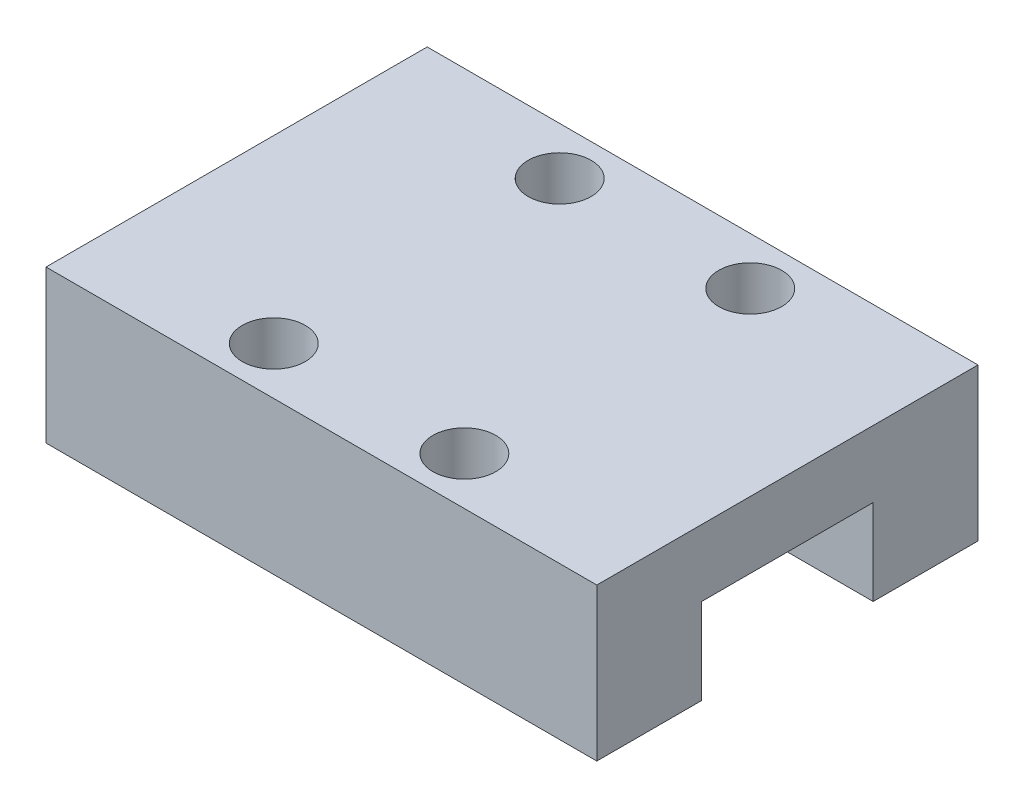
ISO-10303-21;
HEADER;
FILE_DESCRIPTION(('STEP AP214'),'2;1');
FILE_NAME('part.step','',(''),(''),'','','');
FILE_SCHEMA(('AUTOMOTIVE_DESIGN { 1 0 10303 214 1 1 1 1 }'));
ENDSEC;
DATA;
#1=APPLICATION_CONTEXT('core data for automotive mechanical design processes');
#2=APPLICATION_PROTOCOL_DEFINITION('international standard','automotive_design',2000,#1);
#3=PRODUCT_CONTEXT('',#1,'mechanical');
#4=PRODUCT('Part','Part','',(#3));
#5=PRODUCT_RELATED_PRODUCT_CATEGORY('part','',(#4));
#6=PRODUCT_DEFINITION_FORMATION('','',#4);
#7=PRODUCT_DEFINITION_CONTEXT('part definition',#1,'design');
#8=PRODUCT_DEFINITION('design','',#6,#7);
#9=PRODUCT_DEFINITION_SHAPE('','',#8);
#10=(LENGTH_UNIT() NAMED_UNIT(*) SI_UNIT(.MILLI.,.METRE.));
#11=(NAMED_UNIT(*) PLANE_ANGLE_UNIT() SI_UNIT($,.RADIAN.));
#12=(NAMED_UNIT(*) SI_UNIT($,.STERADIAN.) SOLID_ANGLE_UNIT());
#13=UNCERTAINTY_MEASURE_WITH_UNIT(LENGTH_MEASURE(1.E-05),#10,'distance_accuracy_value','');
#14=(GEOMETRIC_REPRESENTATION_CONTEXT(3) GLOBAL_UNCERTAINTY_ASSIGNED_CONTEXT((#13)) GLOBAL_UNIT_ASSIGNED_CONTEXT((#10,
#11,#12)) REPRESENTATION_CONTEXT('',''));
#15=CARTESIAN_POINT('',(0.,0.,0.));
#16=DIRECTION('',(0.,0.,1.));
#17=DIRECTION('',(1.,0.,0.));
#18=AXIS2_PLACEMENT_3D('',#15,#16,#17);
#19=CARTESIAN_POINT('',(14.45,-7.99999999999999,10.));
#20=DIRECTION('',(0.,0.,-1.));
#21=DIRECTION('',(-1.,0.,0.));
#22=AXIS2_PLACEMENT_3D('',#19,#20,#21);
#23=PLANE('',#22);
#24=DIRECTION('',(0.,-1.,0.));
#25=VECTOR('',#24,1.);
#26=CARTESIAN_POINT('',(-14.45,-7.99999999999999,10.));
#27=LINE('',#26,#25);
#28=CARTESIAN_POINT('',(-14.45,0.,10.));
#29=VERTEX_POINT('',#28);
#30=CARTESIAN_POINT('',(-14.45,-7.99999999999999,10.));
#31=VERTEX_POINT('',#30);
#32=EDGE_CURVE('E132',#29,#31,#27,.T.);
#33=ORIENTED_EDGE('',*,*,#32,.T.);
#34=DIRECTION('',(-1.,0.,0.));
#35=VECTOR('',#34,1.);
#36=CARTESIAN_POINT('',(14.45,-7.99999999999999,10.));
#37=LINE('',#36,#35);
#38=CARTESIAN_POINT('',(14.45,-7.99999999999999,10.));
#39=VERTEX_POINT('',#38);
#40=EDGE_CURVE('E40',#39,#31,#37,.T.);
#41=ORIENTED_EDGE('',*,*,#40,.F.);
#42=DIRECTION('',(0.,-1.,0.));
#43=VECTOR('',#42,1.);
#44=CARTESIAN_POINT('',(14.45,-7.99999999999999,10.));
#45=LINE('',#44,#43);
#46=CARTESIAN_POINT('',(14.45,0.,10.));
#47=VERTEX_POINT('',#46);
#48=EDGE_CURVE('E92',#47,#39,#45,.T.);
#49=ORIENTED_EDGE('',*,*,#48,.F.);
#50=DIRECTION('',(-1.,0.,0.));
#51=VECTOR('',#50,1.);
#52=CARTESIAN_POINT('',(14.45,0.,10.));
#53=LINE('',#52,#51);
#54=EDGE_CURVE('E11',#47,#29,#53,.T.);
#55=ORIENTED_EDGE('',*,*,#54,.T.);
#56=EDGE_LOOP('',(#33,#41,#49,#55));
#57=FACE_BOUND('',#56,.T.);
#58=ADVANCED_FACE('F32',(#57),#23,.F.);
#59=CARTESIAN_POINT('',(14.45,-7.99999999999999,4.5));
#60=DIRECTION('',(0.,1.,0.));
#61=DIRECTION('',(0.,0.,1.));
#62=AXIS2_PLACEMENT_3D('',#59,#60,#61);
#63=PLANE('',#62);
#64=DIRECTION('',(0.,0.,-1.));
#65=VECTOR('',#64,1.);
#66=CARTESIAN_POINT('',(-14.45,-7.99999999999999,4.5));
#67=LINE('',#66,#65);
#68=CARTESIAN_POINT('',(-14.45,-7.99999999999999,4.5));
#69=VERTEX_POINT('',#68);
#70=EDGE_CURVE('E134',#31,#69,#67,.T.);
#71=ORIENTED_EDGE('',*,*,#70,.T.);
#72=DIRECTION('',(-1.,0.,0.));
#73=VECTOR('',#72,1.);
#74=CARTESIAN_POINT('',(14.45,-7.99999999999999,4.5));
#75=LINE('',#74,#73);
#76=CARTESIAN_POINT('',(14.45,-7.99999999999999,4.5));
#77=VERTEX_POINT('',#76);
#78=EDGE_CURVE('E152',#77,#69,#75,.T.);
#79=ORIENTED_EDGE('',*,*,#78,.F.);
#80=DIRECTION('',(0.,0.,-1.));
#81=VECTOR('',#80,1.);
#82=CARTESIAN_POINT('',(14.45,-7.99999999999999,4.5));
#83=LINE('',#82,#81);
#84=EDGE_CURVE('E160',#39,#77,#83,.T.);
#85=ORIENTED_EDGE('',*,*,#84,.F.);
#86=ORIENTED_EDGE('',*,*,#40,.T.);
#87=EDGE_LOOP('',(#71,#79,#85,#86));
#88=FACE_BOUND('',#87,.T.);
#89=ADVANCED_FACE('F158',(#88),#63,.F.);
#90=CARTESIAN_POINT('',(14.45,-3.49999999999999,4.5));
#91=DIRECTION('',(0.,0.,1.));
#92=DIRECTION('',(1.,0.,0.));
#93=AXIS2_PLACEMENT_3D('',#90,#91,#92);
#94=PLANE('',#93);
#95=DIRECTION('',(0.,1.,0.));
#96=VECTOR('',#95,1.);
#97=CARTESIAN_POINT('',(-14.45,-3.49999999999999,4.5));
#98=LINE('',#97,#96);
#99=CARTESIAN_POINT('',(-14.45,-3.49999999999999,4.5));
#100=VERTEX_POINT('',#99);
#101=EDGE_CURVE('E137',#69,#100,#98,.T.);
#102=ORIENTED_EDGE('',*,*,#101,.T.);
#103=DIRECTION('',(-1.,0.,0.));
#104=VECTOR('',#103,1.);
#105=CARTESIAN_POINT('',(14.45,-3.49999999999999,4.5));
#106=LINE('',#105,#104);
#107=CARTESIAN_POINT('',(14.45,-3.49999999999999,4.5));
#108=VERTEX_POINT('',#107);
#109=EDGE_CURVE('E149',#108,#100,#106,.T.);
#110=ORIENTED_EDGE('',*,*,#109,.F.);
#111=DIRECTION('',(0.,1.,0.));
#112=VECTOR('',#111,1.);
#113=CARTESIAN_POINT('',(14.45,-3.49999999999999,4.5));
#114=LINE('',#113,#112);
#115=EDGE_CURVE('E173',#77,#108,#114,.T.);
#116=ORIENTED_EDGE('',*,*,#115,.F.);
#117=ORIENTED_EDGE('',*,*,#78,.T.);
#118=EDGE_LOOP('',(#102,#110,#116,#117));
#119=FACE_BOUND('',#118,.T.);
#120=ADVANCED_FACE('F169',(#119),#94,.F.);
#121=CARTESIAN_POINT('',(14.45,-3.49999999999999,-4.5));
#122=DIRECTION('',(0.,1.,0.));
#123=DIRECTION('',(0.,0.,1.));
#124=AXIS2_PLACEMENT_3D('',#121,#122,#123);
#125=PLANE('',#124);
#126=DIRECTION('',(0.,0.,-1.));
#127=VECTOR('',#126,1.);
#128=CARTESIAN_POINT('',(-14.45,-3.49999999999999,-4.5));
#129=LINE('',#128,#127);
#130=CARTESIAN_POINT('',(-14.45,-3.49999999999999,-4.5));
#131=VERTEX_POINT('',#130);
#132=EDGE_CURVE('E139',#100,#131,#129,.T.);
#133=ORIENTED_EDGE('',*,*,#132,.T.);
#134=DIRECTION('',(-1.,0.,0.));
#135=VECTOR('',#134,1.);
#136=CARTESIAN_POINT('',(14.45,-3.49999999999999,-4.5));
#137=LINE('',#136,#135);
#138=CARTESIAN_POINT('',(14.45,-3.49999999999999,-4.5));
#139=VERTEX_POINT('',#138);
#140=EDGE_CURVE('E121',#139,#131,#137,.T.);
#141=ORIENTED_EDGE('',*,*,#140,.F.);
#142=DIRECTION('',(0.,0.,-1.));
#143=VECTOR('',#142,1.);
#144=CARTESIAN_POINT('',(14.45,-3.49999999999999,-4.5));
#145=LINE('',#144,#143);
#146=EDGE_CURVE('E112',#108,#139,#145,.T.);
#147=ORIENTED_EDGE('',*,*,#146,.F.);
#148=ORIENTED_EDGE('',*,*,#109,.T.);
#149=EDGE_LOOP('',(#133,#141,#147,#148));
#150=FACE_BOUND('',#149,.T.);
#151=ADVANCED_FACE('F172',(#150),#125,.F.);
#152=CARTESIAN_POINT('',(14.45,-7.99999999999999,-4.5));
#153=DIRECTION('',(0.,0.,-1.));
#154=DIRECTION('',(-1.,0.,0.));
#155=AXIS2_PLACEMENT_3D('',#152,#153,#154);
#156=PLANE('',#155);
#157=DIRECTION('',(0.,-1.,0.));
#158=VECTOR('',#157,1.);
#159=CARTESIAN_POINT('',(-14.45,-7.99999999999999,-4.5));
#160=LINE('',#159,#158);
#161=CARTESIAN_POINT('',(-14.45,-7.99999999999999,-4.5));
#162=VERTEX_POINT('',#161);
#163=EDGE_CURVE('E120',#131,#162,#160,.T.);
#164=ORIENTED_EDGE('',*,*,#163,.T.);
#165=DIRECTION('',(-1.,0.,0.));
#166=VECTOR('',#165,1.);
#167=CARTESIAN_POINT('',(14.45,-7.99999999999999,-4.5));
#168=LINE('',#167,#166);
#169=CARTESIAN_POINT('',(14.45,-7.99999999999999,-4.5));
#170=VERTEX_POINT('',#169);
#171=EDGE_CURVE('E117',#170,#162,#168,.T.);
#172=ORIENTED_EDGE('',*,*,#171,.F.);
#173=DIRECTION('',(0.,-1.,0.));
#174=VECTOR('',#173,1.);
#175=CARTESIAN_POINT('',(14.45,-7.99999999999999,-4.5));
#176=LINE('',#175,#174);
#177=EDGE_CURVE('E106',#139,#170,#176,.T.);
#178=ORIENTED_EDGE('',*,*,#177,.F.);
#179=ORIENTED_EDGE('',*,*,#140,.T.);
#180=EDGE_LOOP('',(#164,#172,#178,#179));
#181=FACE_BOUND('',#180,.T.);
#182=ADVANCED_FACE('F118',(#181),#156,.F.);
#183=CARTESIAN_POINT('',(14.45,-7.99999999999999,-10.));
#184=DIRECTION('',(0.,1.,0.));
#185=DIRECTION('',(0.,0.,1.));
#186=AXIS2_PLACEMENT_3D('',#183,#184,#185);
#187=PLANE('',#186);
#188=DIRECTION('',(0.,0.,-1.));
#189=VECTOR('',#188,1.);
#190=CARTESIAN_POINT('',(-14.45,-7.99999999999999,-10.));
#191=LINE('',#190,#189);
#192=CARTESIAN_POINT('',(-14.45,-7.99999999999999,-10.));
#193=VERTEX_POINT('',#192);
#194=EDGE_CURVE('E78',#162,#193,#191,.T.);
#195=ORIENTED_EDGE('',*,*,#194,.T.);
#196=DIRECTION('',(-1.,0.,0.));
#197=VECTOR('',#196,1.);
#198=CARTESIAN_POINT('',(14.45,-7.99999999999999,-10.));
#199=LINE('',#198,#197);
#200=CARTESIAN_POINT('',(14.45,-7.99999999999999,-10.));
#201=VERTEX_POINT('',#200);
#202=EDGE_CURVE('E122',#201,#193,#199,.T.);
#203=ORIENTED_EDGE('',*,*,#202,.F.);
#204=DIRECTION('',(0.,0.,-1.));
#205=VECTOR('',#204,1.);
#206=CARTESIAN_POINT('',(14.45,-7.99999999999999,-10.));
#207=LINE('',#206,#205);
#208=EDGE_CURVE('E110',#170,#201,#207,.T.);
#209=ORIENTED_EDGE('',*,*,#208,.F.);
#210=ORIENTED_EDGE('',*,*,#171,.T.);
#211=EDGE_LOOP('',(#195,#203,#209,#210));
#212=FACE_BOUND('',#211,.T.);
#213=ADVANCED_FACE('F124',(#212),#187,.F.);
#214=CARTESIAN_POINT('',(14.45,0.,-10.));
#215=DIRECTION('',(0.,0.,1.));
#216=DIRECTION('',(1.,0.,0.));
#217=AXIS2_PLACEMENT_3D('',#214,#215,#216);
#218=PLANE('',#217);
#219=DIRECTION('',(0.,1.,0.));
#220=VECTOR('',#219,1.);
#221=CARTESIAN_POINT('',(-14.45,0.,-10.));
#222=LINE('',#221,#220);
#223=CARTESIAN_POINT('',(-14.45,0.,-10.));
#224=VERTEX_POINT('',#223);
#225=EDGE_CURVE('E85',#193,#224,#222,.T.);
#226=ORIENTED_EDGE('',*,*,#225,.T.);
#227=DIRECTION('',(-1.,0.,0.));
#228=VECTOR('',#227,1.);
#229=CARTESIAN_POINT('',(14.45,0.,-10.));
#230=LINE('',#229,#228);
#231=CARTESIAN_POINT('',(14.45,0.,-10.));
#232=VERTEX_POINT('',#231);
#233=EDGE_CURVE('E128',#232,#224,#230,.T.);
#234=ORIENTED_EDGE('',*,*,#233,.F.);
#235=DIRECTION('',(0.,1.,0.));
#236=VECTOR('',#235,1.);
#237=CARTESIAN_POINT('',(14.45,0.,-10.));
#238=LINE('',#237,#236);
#239=EDGE_CURVE('E126',#201,#232,#238,.T.);
#240=ORIENTED_EDGE('',*,*,#239,.F.);
#241=ORIENTED_EDGE('',*,*,#202,.T.);
#242=EDGE_LOOP('',(#226,#234,#240,#241));
#243=FACE_BOUND('',#242,.T.);
#244=ADVANCED_FACE('F215',(#243),#218,.F.);
#245=CARTESIAN_POINT('',(14.45,0.,0.));
#246=DIRECTION('',(0.,-1.,0.));
#247=DIRECTION('',(0.,0.,-1.));
#248=AXIS2_PLACEMENT_3D('',#245,#246,#247);
#249=PLANE('',#248);
#250=CARTESIAN_POINT('',(-5.,0.,-7.5));
#251=DIRECTION('',(0.,1.,0.));
#252=DIRECTION('',(0.,0.,1.));
#253=AXIS2_PLACEMENT_3D('',#250,#251,#252);
#254=CIRCLE('',#253,1.651);
#255=CARTESIAN_POINT('',(-5.,0.,-5.849));
#256=VERTEX_POINT('',#255);
#257=EDGE_CURVE('E185',#256,#256,#254,.T.);
#258=ORIENTED_EDGE('',*,*,#257,.F.);
#259=EDGE_LOOP('',(#258));
#260=FACE_BOUND('',#259,.T.);
#261=CARTESIAN_POINT('',(-5.,0.,7.5));
#262=DIRECTION('',(0.,1.,0.));
#263=DIRECTION('',(0.,0.,1.));
#264=AXIS2_PLACEMENT_3D('',#261,#262,#263);
#265=CIRCLE('',#264,1.651);
#266=CARTESIAN_POINT('',(-5.,0.,9.151));
#267=VERTEX_POINT('',#266);
#268=EDGE_CURVE('E191',#267,#267,#265,.T.);
#269=ORIENTED_EDGE('',*,*,#268,.F.);
#270=EDGE_LOOP('',(#269));
#271=FACE_BOUND('',#270,.T.);
#272=CARTESIAN_POINT('',(5.,0.,7.5));
#273=DIRECTION('',(0.,1.,0.));
#274=DIRECTION('',(0.,0.,1.));
#275=AXIS2_PLACEMENT_3D('',#272,#273,#274);
#276=CIRCLE('',#275,1.651);
#277=CARTESIAN_POINT('',(5.,0.,9.15099999999999));
#278=VERTEX_POINT('',#277);
#279=EDGE_CURVE('E197',#278,#278,#276,.T.);
#280=ORIENTED_EDGE('',*,*,#279,.F.);
#281=EDGE_LOOP('',(#280));
#282=FACE_BOUND('',#281,.T.);
#283=CARTESIAN_POINT('',(5.,0.,-7.5));
#284=DIRECTION('',(0.,1.,0.));
#285=DIRECTION('',(0.,0.,1.));
#286=AXIS2_PLACEMENT_3D('',#283,#284,#285);
#287=CIRCLE('',#286,1.651);
#288=CARTESIAN_POINT('',(5.,0.,-5.84900000000001));
#289=VERTEX_POINT('',#288);
#290=EDGE_CURVE('E179',#289,#289,#287,.T.);
#291=ORIENTED_EDGE('',*,*,#290,.F.);
#292=EDGE_LOOP('',(#291));
#293=FACE_BOUND('',#292,.T.);
#294=DIRECTION('',(0.,0.,1.));
#295=VECTOR('',#294,1.);
#296=CARTESIAN_POINT('',(-14.45,0.,0.));
#297=LINE('',#296,#295);
#298=EDGE_CURVE('E144',#224,#29,#297,.T.);
#299=ORIENTED_EDGE('',*,*,#298,.T.);
#300=ORIENTED_EDGE('',*,*,#54,.F.);
#301=DIRECTION('',(0.,0.,1.));
#302=VECTOR('',#301,1.);
#303=CARTESIAN_POINT('',(14.45,0.,10.));
#304=LINE('',#303,#302);
#305=EDGE_CURVE('E48',#232,#47,#304,.T.);
#306=ORIENTED_EDGE('',*,*,#305,.F.);
#307=ORIENTED_EDGE('',*,*,#233,.T.);
#308=EDGE_LOOP('',(#299,#300,#306,#307));
#309=FACE_BOUND('',#308,.T.);
#310=ADVANCED_FACE('F212',(#260,#271,#282,#293,#309),#249,.F.);
#311=CARTESIAN_POINT('',(14.45,0.,0.));
#312=DIRECTION('',(-1.,0.,0.));
#313=DIRECTION('',(0.,0.,1.));
#314=AXIS2_PLACEMENT_3D('',#311,#312,#313);
#315=PLANE('',#314);
#316=ORIENTED_EDGE('',*,*,#305,.T.);
#317=ORIENTED_EDGE('',*,*,#48,.T.);
#318=ORIENTED_EDGE('',*,*,#84,.T.);
#319=ORIENTED_EDGE('',*,*,#115,.T.);
#320=ORIENTED_EDGE('',*,*,#146,.T.);
#321=ORIENTED_EDGE('',*,*,#177,.T.);
#322=ORIENTED_EDGE('',*,*,#208,.T.);
#323=ORIENTED_EDGE('',*,*,#239,.T.);
#324=EDGE_LOOP('',(#316,#317,#318,#319,#320,#321,#322,#323));
#325=FACE_BOUND('',#324,.T.);
#326=ADVANCED_FACE('F108',(#325),#315,.F.);
#327=CARTESIAN_POINT('',(-14.45,0.,0.));
#328=DIRECTION('',(-1.,0.,0.));
#329=DIRECTION('',(0.,0.,1.));
#330=AXIS2_PLACEMENT_3D('',#327,#328,#329);
#331=PLANE('',#330);
#332=ORIENTED_EDGE('',*,*,#32,.F.);
#333=ORIENTED_EDGE('',*,*,#298,.F.);
#334=ORIENTED_EDGE('',*,*,#225,.F.);
#335=ORIENTED_EDGE('',*,*,#194,.F.);
#336=ORIENTED_EDGE('',*,*,#163,.F.);
#337=ORIENTED_EDGE('',*,*,#132,.F.);
#338=ORIENTED_EDGE('',*,*,#101,.F.);
#339=ORIENTED_EDGE('',*,*,#70,.F.);
#340=EDGE_LOOP('',(#332,#333,#334,#335,#336,#337,#338,#339));
#341=FACE_BOUND('',#340,.T.);
#342=ADVANCED_FACE('F164',(#341),#331,.T.);
#343=CARTESIAN_POINT('',(5.,-6.35,-7.5));
#344=DIRECTION('',(0.,1.,0.));
#345=DIRECTION('',(0.,0.,1.));
#346=AXIS2_PLACEMENT_3D('',#343,#344,#345);
#347=CYLINDRICAL_SURFACE('',#346,1.651);
#348=CARTESIAN_POINT('',(5.,-6.35,-7.5));
#349=DIRECTION('',(0.,1.,0.));
#350=DIRECTION('',(0.,0.,1.));
#351=AXIS2_PLACEMENT_3D('',#348,#349,#350);
#352=CIRCLE('',#351,1.651);
#353=CARTESIAN_POINT('',(5.,-6.35,-5.84900000000001));
#354=VERTEX_POINT('',#353);
#355=EDGE_CURVE('E135',#354,#354,#352,.T.);
#356=ORIENTED_EDGE('',*,*,#355,.F.);
#357=EDGE_LOOP('',(#356));
#358=FACE_BOUND('',#357,.T.);
#359=ORIENTED_EDGE('',*,*,#290,.T.);
#360=EDGE_LOOP('',(#359));
#361=FACE_BOUND('',#360,.T.);
#362=ADVANCED_FACE('F268',(#358,#361),#347,.F.);
#363=CARTESIAN_POINT('',(5.,-6.35,-7.5));
#364=DIRECTION('',(0.,1.,0.));
#365=DIRECTION('',(0.,0.,1.));
#366=AXIS2_PLACEMENT_3D('',#363,#364,#365);
#367=PLANE('',#366);
#368=ORIENTED_EDGE('',*,*,#355,.T.);
#369=EDGE_LOOP('',(#368));
#370=FACE_BOUND('',#369,.T.);
#371=ADVANCED_FACE('F208',(#370),#367,.T.);
#372=CARTESIAN_POINT('',(5.,-6.35,7.5));
#373=DIRECTION('',(0.,1.,0.));
#374=DIRECTION('',(0.,0.,1.));
#375=AXIS2_PLACEMENT_3D('',#372,#373,#374);
#376=CYLINDRICAL_SURFACE('',#375,1.651);
#377=CARTESIAN_POINT('',(5.,-6.35,7.5));
#378=DIRECTION('',(0.,1.,0.));
#379=DIRECTION('',(0.,0.,1.));
#380=AXIS2_PLACEMENT_3D('',#377,#378,#379);
#381=CIRCLE('',#380,1.651);
#382=CARTESIAN_POINT('',(5.,-6.35,9.15099999999999));
#383=VERTEX_POINT('',#382);
#384=EDGE_CURVE('E182',#383,#383,#381,.T.);
#385=ORIENTED_EDGE('',*,*,#384,.F.);
#386=EDGE_LOOP('',(#385));
#387=FACE_BOUND('',#386,.T.);
#388=ORIENTED_EDGE('',*,*,#279,.T.);
#389=EDGE_LOOP('',(#388));
#390=FACE_BOUND('',#389,.T.);
#391=ADVANCED_FACE('F205',(#387,#390),#376,.F.);
#392=CARTESIAN_POINT('',(5.,-6.35,7.5));
#393=DIRECTION('',(0.,1.,0.));
#394=DIRECTION('',(0.,0.,1.));
#395=AXIS2_PLACEMENT_3D('',#392,#393,#394);
#396=PLANE('',#395);
#397=ORIENTED_EDGE('',*,*,#384,.T.);
#398=EDGE_LOOP('',(#397));
#399=FACE_BOUND('',#398,.T.);
#400=ADVANCED_FACE('F203',(#399),#396,.T.);
#401=CARTESIAN_POINT('',(-5.,-6.35,7.5));
#402=DIRECTION('',(0.,1.,0.));
#403=DIRECTION('',(0.,0.,1.));
#404=AXIS2_PLACEMENT_3D('',#401,#402,#403);
#405=CYLINDRICAL_SURFACE('',#404,1.651);
#406=CARTESIAN_POINT('',(-5.,-6.35,7.5));
#407=DIRECTION('',(0.,1.,0.));
#408=DIRECTION('',(0.,0.,1.));
#409=AXIS2_PLACEMENT_3D('',#406,#407,#408);
#410=CIRCLE('',#409,1.651);
#411=CARTESIAN_POINT('',(-5.,-6.35,9.151));
#412=VERTEX_POINT('',#411);
#413=EDGE_CURVE('E194',#412,#412,#410,.T.);
#414=ORIENTED_EDGE('',*,*,#413,.F.);
#415=EDGE_LOOP('',(#414));
#416=FACE_BOUND('',#415,.T.);
#417=ORIENTED_EDGE('',*,*,#268,.T.);
#418=EDGE_LOOP('',(#417));
#419=FACE_BOUND('',#418,.T.);
#420=ADVANCED_FACE('F306',(#416,#419),#405,.F.);
#421=CARTESIAN_POINT('',(-5.,-6.35,7.5));
#422=DIRECTION('',(0.,1.,0.));
#423=DIRECTION('',(0.,0.,1.));
#424=AXIS2_PLACEMENT_3D('',#421,#422,#423);
#425=PLANE('',#424);
#426=ORIENTED_EDGE('',*,*,#413,.T.);
#427=EDGE_LOOP('',(#426));
#428=FACE_BOUND('',#427,.T.);
#429=ADVANCED_FACE('F315',(#428),#425,.T.);
#430=CARTESIAN_POINT('',(-5.,-6.35,-7.5));
#431=DIRECTION('',(0.,1.,0.));
#432=DIRECTION('',(0.,0.,1.));
#433=AXIS2_PLACEMENT_3D('',#430,#431,#432);
#434=CYLINDRICAL_SURFACE('',#433,1.651);
#435=CARTESIAN_POINT('',(-5.,-6.35,-7.5));
#436=DIRECTION('',(0.,1.,0.));
#437=DIRECTION('',(0.,0.,1.));
#438=AXIS2_PLACEMENT_3D('',#435,#436,#437);
#439=CIRCLE('',#438,1.651);
#440=CARTESIAN_POINT('',(-5.,-6.35,-5.849));
#441=VERTEX_POINT('',#440);
#442=EDGE_CURVE('E188',#441,#441,#439,.T.);
#443=ORIENTED_EDGE('',*,*,#442,.F.);
#444=EDGE_LOOP('',(#443));
#445=FACE_BOUND('',#444,.T.);
#446=ORIENTED_EDGE('',*,*,#257,.T.);
#447=EDGE_LOOP('',(#446));
#448=FACE_BOUND('',#447,.T.);
#449=ADVANCED_FACE('F325',(#445,#448),#434,.F.);
#450=CARTESIAN_POINT('',(-5.,-6.35,-7.5));
#451=DIRECTION('',(0.,1.,0.));
#452=DIRECTION('',(0.,0.,1.));
#453=AXIS2_PLACEMENT_3D('',#450,#451,#452);
#454=PLANE('',#453);
#455=ORIENTED_EDGE('',*,*,#442,.T.);
#456=EDGE_LOOP('',(#455));
#457=FACE_BOUND('',#456,.T.);
#458=ADVANCED_FACE('F335',(#457),#454,.T.);
#459=CLOSED_SHELL('',(#58,#89,#120,#151,#182,#213,#244,#310,#326,#342,#362,#371,#391,#400,#420,
#429,#449,#458));
#460=MANIFOLD_SOLID_BREP('B2',#459);
#461=ADVANCED_BREP_SHAPE_REPRESENTATION('',(#18,#460),#14);
#462=SHAPE_DEFINITION_REPRESENTATION(#9,#461);
ENDSEC;
END-ISO-10303-21;
